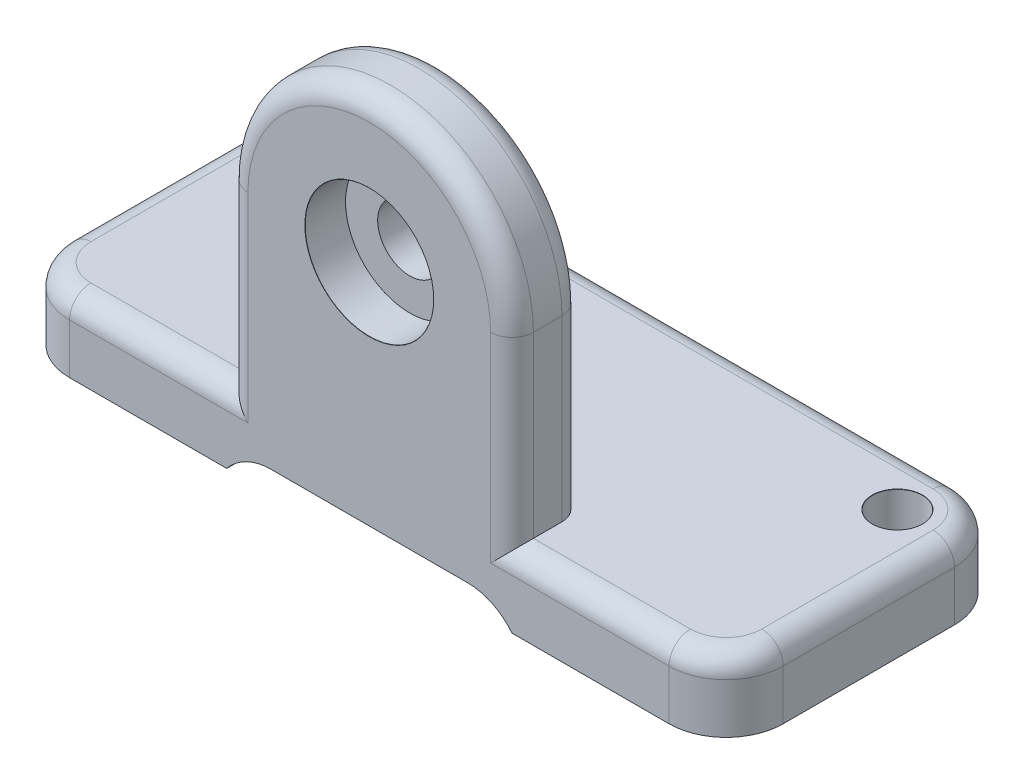
ISO-10303-21;
HEADER;
FILE_DESCRIPTION(('STEP AP214'),'2;1');
FILE_NAME('part.step','',(''),(''),'','','');
FILE_SCHEMA(('AUTOMOTIVE_DESIGN { 1 0 10303 214 1 1 1 1 }'));
ENDSEC;
DATA;
#1=APPLICATION_CONTEXT('core data for automotive mechanical design processes');
#2=APPLICATION_PROTOCOL_DEFINITION('international standard','automotive_design',2000,#1);
#3=PRODUCT_CONTEXT('',#1,'mechanical');
#4=PRODUCT('Part','Part','',(#3));
#5=PRODUCT_RELATED_PRODUCT_CATEGORY('part','',(#4));
#6=PRODUCT_DEFINITION_FORMATION('','',#4);
#7=PRODUCT_DEFINITION_CONTEXT('part definition',#1,'design');
#8=PRODUCT_DEFINITION('design','',#6,#7);
#9=PRODUCT_DEFINITION_SHAPE('','',#8);
#10=(LENGTH_UNIT() NAMED_UNIT(*) SI_UNIT(.MILLI.,.METRE.));
#11=(NAMED_UNIT(*) PLANE_ANGLE_UNIT() SI_UNIT($,.RADIAN.));
#12=(NAMED_UNIT(*) SI_UNIT($,.STERADIAN.) SOLID_ANGLE_UNIT());
#13=UNCERTAINTY_MEASURE_WITH_UNIT(LENGTH_MEASURE(1.E-05),#10,'distance_accuracy_value','');
#14=(GEOMETRIC_REPRESENTATION_CONTEXT(3) GLOBAL_UNCERTAINTY_ASSIGNED_CONTEXT((#13)) GLOBAL_UNIT_ASSIGNED_CONTEXT((#10,
#11,#12)) REPRESENTATION_CONTEXT('',''));
#15=CARTESIAN_POINT('',(0.,0.,0.));
#16=DIRECTION('',(0.,0.,1.));
#17=DIRECTION('',(1.,0.,0.));
#18=AXIS2_PLACEMENT_3D('',#15,#16,#17);
#19=CARTESIAN_POINT('',(0.,0.,0.));
#20=DIRECTION('',(0.,-1.,0.));
#21=DIRECTION('',(0.,0.,-1.));
#22=AXIS2_PLACEMENT_3D('',#19,#20,#21);
#23=PLANE('',#22);
#24=CARTESIAN_POINT('',(8.,0.,-32.));
#25=DIRECTION('',(0.,1.,0.));
#26=DIRECTION('',(0.,0.,1.));
#27=AXIS2_PLACEMENT_3D('',#24,#25,#26);
#28=CIRCLE('',#27,3.5);
#29=CARTESIAN_POINT('',(8.,0.,-28.5));
#30=VERTEX_POINT('',#29);
#31=EDGE_CURVE('E573',#30,#30,#28,.T.);
#32=ORIENTED_EDGE('',*,*,#31,.T.);
#33=EDGE_LOOP('',(#32));
#34=FACE_BOUND('',#33,.T.);
#35=DIRECTION('',(0.,0.,1.));
#36=VECTOR('',#35,1.);
#37=CARTESIAN_POINT('',(0.,0.,0.));
#38=LINE('',#37,#36);
#39=CARTESIAN_POINT('',(0.,0.,-32.));
#40=VERTEX_POINT('',#39);
#41=CARTESIAN_POINT('',(0.,0.,-8.));
#42=VERTEX_POINT('',#41);
#43=EDGE_CURVE('E264',#40,#42,#38,.T.);
#44=ORIENTED_EDGE('',*,*,#43,.F.);
#45=CARTESIAN_POINT('',(8.,0.,-32.));
#46=DIRECTION('',(0.,-1.,0.));
#47=DIRECTION('',(0.,0.,-1.));
#48=AXIS2_PLACEMENT_3D('',#45,#46,#47);
#49=CIRCLE('',#48,8.);
#50=CARTESIAN_POINT('',(8.,0.,-40.));
#51=VERTEX_POINT('',#50);
#52=EDGE_CURVE('E226',#40,#51,#49,.T.);
#53=ORIENTED_EDGE('',*,*,#52,.T.);
#54=DIRECTION('',(-1.,0.,0.));
#55=VECTOR('',#54,1.);
#56=CARTESIAN_POINT('',(0.,0.,-40.));
#57=LINE('',#56,#55);
#58=CARTESIAN_POINT('',(30.0374723293531,0.,-40.));
#59=VERTEX_POINT('',#58);
#60=EDGE_CURVE('E209',#59,#51,#57,.T.);
#61=ORIENTED_EDGE('',*,*,#60,.F.);
#62=DIRECTION('',(0.,0.,1.));
#63=VECTOR('',#62,1.);
#64=CARTESIAN_POINT('',(30.0374723293531,0.,-40.));
#65=LINE('',#64,#63);
#66=CARTESIAN_POINT('',(30.0374723293531,0.,0.));
#67=VERTEX_POINT('',#66);
#68=EDGE_CURVE('E224',#59,#67,#65,.T.);
#69=ORIENTED_EDGE('',*,*,#68,.T.);
#70=DIRECTION('',(1.,0.,0.));
#71=VECTOR('',#70,1.);
#72=CARTESIAN_POINT('',(0.,0.,0.));
#73=LINE('',#72,#71);
#74=CARTESIAN_POINT('',(8.,0.,0.));
#75=VERTEX_POINT('',#74);
#76=EDGE_CURVE('E269',#75,#67,#73,.T.);
#77=ORIENTED_EDGE('',*,*,#76,.F.);
#78=CARTESIAN_POINT('',(8.,0.,-8.));
#79=DIRECTION('',(0.,-1.,0.));
#80=DIRECTION('',(0.,0.,-1.));
#81=AXIS2_PLACEMENT_3D('',#78,#79,#80);
#82=CIRCLE('',#81,8.);
#83=EDGE_CURVE('E309',#75,#42,#82,.T.);
#84=ORIENTED_EDGE('',*,*,#83,.T.);
#85=EDGE_LOOP('',(#44,#53,#61,#69,#77,#84));
#86=FACE_BOUND('',#85,.T.);
#87=ADVANCED_FACE('F41',(#34,#86),#23,.T.);
#88=CARTESIAN_POINT('',(0.,10.,0.));
#89=DIRECTION('',(1.,0.,0.));
#90=DIRECTION('',(0.,0.,-1.));
#91=AXIS2_PLACEMENT_3D('',#88,#89,#90);
#92=PLANE('',#91);
#93=DIRECTION('',(0.,-1.,0.));
#94=VECTOR('',#93,1.);
#95=CARTESIAN_POINT('',(0.,10.,-8.));
#96=LINE('',#95,#94);
#97=CARTESIAN_POINT('',(0.,7.,-8.));
#98=VERTEX_POINT('',#97);
#99=EDGE_CURVE('E302',#42,#98,#96,.F.);
#100=ORIENTED_EDGE('',*,*,#99,.T.);
#101=DIRECTION('',(0.,0.,1.));
#102=VECTOR('',#101,1.);
#103=CARTESIAN_POINT('',(0.,7.,0.));
#104=LINE('',#103,#102);
#105=CARTESIAN_POINT('',(0.,7.,-32.));
#106=VERTEX_POINT('',#105);
#107=EDGE_CURVE('E381',#98,#106,#104,.F.);
#108=ORIENTED_EDGE('',*,*,#107,.T.);
#109=DIRECTION('',(0.,-1.,0.));
#110=VECTOR('',#109,1.);
#111=CARTESIAN_POINT('',(0.,10.,-32.));
#112=LINE('',#111,#110);
#113=EDGE_CURVE('E306',#106,#40,#112,.T.);
#114=ORIENTED_EDGE('',*,*,#113,.T.);
#115=ORIENTED_EDGE('',*,*,#43,.T.);
#116=EDGE_LOOP('',(#100,#108,#114,#115));
#117=FACE_BOUND('',#116,.T.);
#118=ADVANCED_FACE('F615',(#117),#92,.F.);
#119=CARTESIAN_POINT('',(0.,10.,0.));
#120=DIRECTION('',(0.,0.,-1.));
#121=DIRECTION('',(-1.,0.,0.));
#122=AXIS2_PLACEMENT_3D('',#119,#120,#121);
#123=PLANE('',#122);
#124=DIRECTION('',(0.,-1.,0.));
#125=VECTOR('',#124,1.);
#126=CARTESIAN_POINT('',(92.,10.,0.));
#127=LINE('',#126,#125);
#128=CARTESIAN_POINT('',(92.,0.,0.));
#129=VERTEX_POINT('',#128);
#130=CARTESIAN_POINT('',(92.,7.,0.));
#131=VERTEX_POINT('',#130);
#132=EDGE_CURVE('E292',#129,#131,#127,.F.);
#133=ORIENTED_EDGE('',*,*,#132,.T.);
#134=DIRECTION('',(1.,0.,0.));
#135=VECTOR('',#134,1.);
#136=CARTESIAN_POINT('',(0.,7.,0.));
#137=LINE('',#136,#135);
#138=CARTESIAN_POINT('',(67.,7.,0.));
#139=VERTEX_POINT('',#138);
#140=EDGE_CURVE('E375',#131,#139,#137,.F.);
#141=ORIENTED_EDGE('',*,*,#140,.T.);
#142=DIRECTION('',(0.,1.,0.));
#143=VECTOR('',#142,1.);
#144=CARTESIAN_POINT('',(67.,35.,0.));
#145=LINE('',#144,#143);
#146=CARTESIAN_POINT('',(67.,35.,0.));
#147=VERTEX_POINT('',#146);
#148=EDGE_CURVE('E368',#139,#147,#145,.T.);
#149=ORIENTED_EDGE('',*,*,#148,.T.);
#150=CARTESIAN_POINT('',(50.,35.,0.));
#151=DIRECTION('',(0.,0.,-1.));
#152=DIRECTION('',(-1.,0.,0.));
#153=AXIS2_PLACEMENT_3D('',#150,#151,#152);
#154=CIRCLE('',#153,17.);
#155=CARTESIAN_POINT('',(33.,35.,0.));
#156=VERTEX_POINT('',#155);
#157=EDGE_CURVE('E362',#147,#156,#154,.F.);
#158=ORIENTED_EDGE('',*,*,#157,.T.);
#159=DIRECTION('',(0.,-1.,0.));
#160=VECTOR('',#159,1.);
#161=CARTESIAN_POINT('',(33.,10.,0.));
#162=LINE('',#161,#160);
#163=CARTESIAN_POINT('',(33.,7.,0.));
#164=VERTEX_POINT('',#163);
#165=EDGE_CURVE('E365',#156,#164,#162,.T.);
#166=ORIENTED_EDGE('',*,*,#165,.T.);
#167=DIRECTION('',(1.,0.,0.));
#168=VECTOR('',#167,1.);
#169=CARTESIAN_POINT('',(0.,7.,0.));
#170=LINE('',#169,#168);
#171=CARTESIAN_POINT('',(8.,7.,0.));
#172=VERTEX_POINT('',#171);
#173=EDGE_CURVE('E371',#164,#172,#170,.F.);
#174=ORIENTED_EDGE('',*,*,#173,.T.);
#175=DIRECTION('',(0.,-1.,0.));
#176=VECTOR('',#175,1.);
#177=CARTESIAN_POINT('',(8.,10.,0.));
#178=LINE('',#177,#176);
#179=EDGE_CURVE('E289',#172,#75,#178,.T.);
#180=ORIENTED_EDGE('',*,*,#179,.T.);
#181=ORIENTED_EDGE('',*,*,#76,.T.);
#182=CARTESIAN_POINT('',(36.2824703277515,-5.,0.));
#183=DIRECTION('',(0.,0.,-1.));
#184=DIRECTION('',(-1.,0.,0.));
#185=AXIS2_PLACEMENT_3D('',#182,#183,#184);
#186=CIRCLE('',#185,8.);
#187=CARTESIAN_POINT('',(36.2824703277515,3.,0.));
#188=VERTEX_POINT('',#187);
#189=EDGE_CURVE('E218',#67,#188,#186,.T.);
#190=ORIENTED_EDGE('',*,*,#189,.T.);
#191=DIRECTION('',(-1.,0.,0.));
#192=VECTOR('',#191,1.);
#193=CARTESIAN_POINT('',(30.0374723293531,3.,0.));
#194=LINE('',#193,#192);
#195=CARTESIAN_POINT('',(63.7550020016016,3.,0.));
#196=VERTEX_POINT('',#195);
#197=EDGE_CURVE('E241',#196,#188,#194,.T.);
#198=ORIENTED_EDGE('',*,*,#197,.F.);
#199=CARTESIAN_POINT('',(63.7550020016016,-5.,0.));
#200=DIRECTION('',(0.,0.,-1.));
#201=DIRECTION('',(-1.,0.,0.));
#202=AXIS2_PLACEMENT_3D('',#199,#200,#201);
#203=CIRCLE('',#202,8.);
#204=CARTESIAN_POINT('',(70.,0.,0.));
#205=VERTEX_POINT('',#204);
#206=EDGE_CURVE('E321',#196,#205,#203,.T.);
#207=ORIENTED_EDGE('',*,*,#206,.T.);
#208=EDGE_CURVE('E268',#205,#129,#73,.T.);
#209=ORIENTED_EDGE('',*,*,#208,.T.);
#210=EDGE_LOOP('',(#133,#141,#149,#158,#166,#174,#180,#181,#190,#198,#207,#209));
#211=FACE_BOUND('',#210,.T.);
#212=CARTESIAN_POINT('',(50.,35.,0.));
#213=DIRECTION('',(0.,0.,1.));
#214=DIRECTION('',(1.,0.,0.));
#215=AXIS2_PLACEMENT_3D('',#212,#213,#214);
#216=CIRCLE('',#215,9.03);
#217=CARTESIAN_POINT('',(59.03,35.,0.));
#218=VERTEX_POINT('',#217);
#219=EDGE_CURVE('E472',#218,#218,#216,.T.);
#220=ORIENTED_EDGE('',*,*,#219,.F.);
#221=EDGE_LOOP('',(#220));
#222=FACE_BOUND('',#221,.T.);
#223=ADVANCED_FACE('F563',(#211,#222),#123,.F.);
#224=CARTESIAN_POINT('',(100.,10.,0.));
#225=DIRECTION('',(-1.,0.,0.));
#226=DIRECTION('',(0.,0.,1.));
#227=AXIS2_PLACEMENT_3D('',#224,#225,#226);
#228=PLANE('',#227);
#229=DIRECTION('',(0.,-1.,0.));
#230=VECTOR('',#229,1.);
#231=CARTESIAN_POINT('',(100.,10.,-32.));
#232=LINE('',#231,#230);
#233=CARTESIAN_POINT('',(100.,0.,-32.));
#234=VERTEX_POINT('',#233);
#235=CARTESIAN_POINT('',(100.,7.,-32.));
#236=VERTEX_POINT('',#235);
#237=EDGE_CURVE('E276',#234,#236,#232,.F.);
#238=ORIENTED_EDGE('',*,*,#237,.T.);
#239=DIRECTION('',(0.,0.,-1.));
#240=VECTOR('',#239,1.);
#241=CARTESIAN_POINT('',(100.,7.,0.));
#242=LINE('',#241,#240);
#243=CARTESIAN_POINT('',(100.,7.,-8.));
#244=VERTEX_POINT('',#243);
#245=EDGE_CURVE('E393',#236,#244,#242,.F.);
#246=ORIENTED_EDGE('',*,*,#245,.T.);
#247=DIRECTION('',(0.,-1.,0.));
#248=VECTOR('',#247,1.);
#249=CARTESIAN_POINT('',(100.,10.,-8.));
#250=LINE('',#249,#248);
#251=CARTESIAN_POINT('',(100.,0.,-8.));
#252=VERTEX_POINT('',#251);
#253=EDGE_CURVE('E280',#244,#252,#250,.T.);
#254=ORIENTED_EDGE('',*,*,#253,.T.);
#255=DIRECTION('',(0.,0.,-1.));
#256=VECTOR('',#255,1.);
#257=CARTESIAN_POINT('',(100.,0.,0.));
#258=LINE('',#257,#256);
#259=EDGE_CURVE('E229',#252,#234,#258,.T.);
#260=ORIENTED_EDGE('',*,*,#259,.T.);
#261=EDGE_LOOP('',(#238,#246,#254,#260));
#262=FACE_BOUND('',#261,.T.);
#263=ADVANCED_FACE('F614',(#262),#228,.F.);
#264=CARTESIAN_POINT('',(0.,10.,-40.));
#265=DIRECTION('',(0.,0.,1.));
#266=DIRECTION('',(1.,0.,0.));
#267=AXIS2_PLACEMENT_3D('',#264,#265,#266);
#268=PLANE('',#267);
#269=DIRECTION('',(0.,-1.,0.));
#270=VECTOR('',#269,1.);
#271=CARTESIAN_POINT('',(8.,10.,-40.));
#272=LINE('',#271,#270);
#273=CARTESIAN_POINT('',(8.,7.,-40.));
#274=VERTEX_POINT('',#273);
#275=EDGE_CURVE('E296',#51,#274,#272,.F.);
#276=ORIENTED_EDGE('',*,*,#275,.T.);
#277=DIRECTION('',(-1.,0.,0.));
#278=VECTOR('',#277,1.);
#279=CARTESIAN_POINT('',(0.,7.,-40.));
#280=LINE('',#279,#278);
#281=CARTESIAN_POINT('',(92.,7.,-40.));
#282=VERTEX_POINT('',#281);
#283=EDGE_CURVE('E387',#274,#282,#280,.F.);
#284=ORIENTED_EDGE('',*,*,#283,.T.);
#285=DIRECTION('',(0.,-1.,0.));
#286=VECTOR('',#285,1.);
#287=CARTESIAN_POINT('',(92.,10.,-40.));
#288=LINE('',#287,#286);
#289=CARTESIAN_POINT('',(92.,0.,-40.));
#290=VERTEX_POINT('',#289);
#291=EDGE_CURVE('E299',#282,#290,#288,.T.);
#292=ORIENTED_EDGE('',*,*,#291,.T.);
#293=CARTESIAN_POINT('',(70.,0.,-40.));
#294=VERTEX_POINT('',#293);
#295=EDGE_CURVE('E228',#290,#294,#57,.T.);
#296=ORIENTED_EDGE('',*,*,#295,.T.);
#297=CARTESIAN_POINT('',(63.7550020016016,-5.,-40.));
#298=DIRECTION('',(0.,0.,1.));
#299=DIRECTION('',(1.,0.,0.));
#300=AXIS2_PLACEMENT_3D('',#297,#298,#299);
#301=CIRCLE('',#300,8.);
#302=CARTESIAN_POINT('',(63.7550020016016,3.,-40.));
#303=VERTEX_POINT('',#302);
#304=EDGE_CURVE('E324',#294,#303,#301,.T.);
#305=ORIENTED_EDGE('',*,*,#304,.T.);
#306=DIRECTION('',(-1.,0.,0.));
#307=VECTOR('',#306,1.);
#308=CARTESIAN_POINT('',(30.0374723293531,3.,-40.));
#309=LINE('',#308,#307);
#310=CARTESIAN_POINT('',(36.2824703277515,3.,-40.));
#311=VERTEX_POINT('',#310);
#312=EDGE_CURVE('E212',#303,#311,#309,.T.);
#313=ORIENTED_EDGE('',*,*,#312,.T.);
#314=CARTESIAN_POINT('',(36.2824703277515,-5.,-40.));
#315=DIRECTION('',(0.,0.,1.));
#316=DIRECTION('',(1.,0.,0.));
#317=AXIS2_PLACEMENT_3D('',#314,#315,#316);
#318=CIRCLE('',#317,8.);
#319=EDGE_CURVE('E205',#311,#59,#318,.T.);
#320=ORIENTED_EDGE('',*,*,#319,.T.);
#321=ORIENTED_EDGE('',*,*,#60,.T.);
#322=EDGE_LOOP('',(#276,#284,#292,#296,#305,#313,#320,#321));
#323=FACE_BOUND('',#322,.T.);
#324=ADVANCED_FACE('F208',(#323),#268,.F.);
#325=CARTESIAN_POINT('',(0.,10.,0.));
#326=DIRECTION('',(0.,-1.,0.));
#327=DIRECTION('',(0.,0.,-1.));
#328=AXIS2_PLACEMENT_3D('',#325,#326,#327);
#329=PLANE('',#328);
#330=CARTESIAN_POINT('',(92.,10.,-32.));
#331=DIRECTION('',(0.,1.,0.));
#332=DIRECTION('',(0.,0.,1.));
#333=AXIS2_PLACEMENT_3D('',#330,#331,#332);
#334=CIRCLE('',#333,3.525);
#335=CARTESIAN_POINT('',(92.,10.,-28.475));
#336=VERTEX_POINT('',#335);
#337=EDGE_CURVE('E333',#336,#336,#334,.T.);
#338=ORIENTED_EDGE('',*,*,#337,.F.);
#339=EDGE_LOOP('',(#338));
#340=FACE_BOUND('',#339,.T.);
#341=CARTESIAN_POINT('',(8.,10.,-32.));
#342=DIRECTION('',(0.,1.,0.));
#343=DIRECTION('',(0.,0.,1.));
#344=AXIS2_PLACEMENT_3D('',#341,#342,#343);
#345=CIRCLE('',#344,3.525);
#346=CARTESIAN_POINT('',(8.,10.,-28.475));
#347=VERTEX_POINT('',#346);
#348=EDGE_CURVE('E582',#347,#347,#345,.T.);
#349=ORIENTED_EDGE('',*,*,#348,.F.);
#350=EDGE_LOOP('',(#349));
#351=FACE_BOUND('',#350,.T.);
#352=CARTESIAN_POINT('',(8.,10.,-8.));
#353=DIRECTION('',(0.,-1.,0.));
#354=DIRECTION('',(0.,0.,-1.));
#355=AXIS2_PLACEMENT_3D('',#352,#353,#354);
#356=CIRCLE('',#355,5.);
#357=CARTESIAN_POINT('',(3.,10.,-8.));
#358=VERTEX_POINT('',#357);
#359=CARTESIAN_POINT('',(8.,10.,-3.));
#360=VERTEX_POINT('',#359);
#361=EDGE_CURVE('E355',#358,#360,#356,.F.);
#362=ORIENTED_EDGE('',*,*,#361,.T.);
#363=DIRECTION('',(1.,0.,0.));
#364=VECTOR('',#363,1.);
#365=CARTESIAN_POINT('',(0.,10.,-3.));
#366=LINE('',#365,#364);
#367=CARTESIAN_POINT('',(30.,10.,-3.));
#368=VERTEX_POINT('',#367);
#369=EDGE_CURVE('E358',#360,#368,#366,.T.);
#370=ORIENTED_EDGE('',*,*,#369,.T.);
#371=DIRECTION('',(0.,0.,-1.));
#372=VECTOR('',#371,1.);
#373=CARTESIAN_POINT('',(30.,10.,0.));
#374=LINE('',#373,#372);
#375=CARTESIAN_POINT('',(30.,10.,-7.));
#376=VERTEX_POINT('',#375);
#377=EDGE_CURVE('E260',#368,#376,#374,.T.);
#378=ORIENTED_EDGE('',*,*,#377,.T.);
#379=CARTESIAN_POINT('',(33.,10.,-7.));
#380=DIRECTION('',(0.,-1.,0.));
#381=DIRECTION('',(0.,0.,-1.));
#382=AXIS2_PLACEMENT_3D('',#379,#380,#381);
#383=CIRCLE('',#382,3.);
#384=CARTESIAN_POINT('',(33.,10.,-10.));
#385=VERTEX_POINT('',#384);
#386=EDGE_CURVE('E11',#376,#385,#383,.T.);
#387=ORIENTED_EDGE('',*,*,#386,.T.);
#388=DIRECTION('',(1.,0.,0.));
#389=VECTOR('',#388,1.);
#390=CARTESIAN_POINT('',(0.,10.,-10.));
#391=LINE('',#390,#389);
#392=CARTESIAN_POINT('',(67.,10.,-10.));
#393=VERTEX_POINT('',#392);
#394=EDGE_CURVE('E249',#385,#393,#391,.T.);
#395=ORIENTED_EDGE('',*,*,#394,.T.);
#396=CARTESIAN_POINT('',(67.,10.,-7.));
#397=DIRECTION('',(0.,-1.,0.));
#398=DIRECTION('',(0.,0.,-1.));
#399=AXIS2_PLACEMENT_3D('',#396,#397,#398);
#400=CIRCLE('',#399,3.);
#401=CARTESIAN_POINT('',(70.,10.,-7.));
#402=VERTEX_POINT('',#401);
#403=EDGE_CURVE('E51',#393,#402,#400,.T.);
#404=ORIENTED_EDGE('',*,*,#403,.T.);
#405=DIRECTION('',(0.,0.,1.));
#406=VECTOR('',#405,1.);
#407=CARTESIAN_POINT('',(70.,10.,0.));
#408=LINE('',#407,#406);
#409=CARTESIAN_POINT('',(70.,10.,-3.));
#410=VERTEX_POINT('',#409);
#411=EDGE_CURVE('E256',#402,#410,#408,.T.);
#412=ORIENTED_EDGE('',*,*,#411,.T.);
#413=DIRECTION('',(1.,0.,0.));
#414=VECTOR('',#413,1.);
#415=CARTESIAN_POINT('',(0.,10.,-3.));
#416=LINE('',#415,#414);
#417=CARTESIAN_POINT('',(92.,10.,-3.));
#418=VERTEX_POINT('',#417);
#419=EDGE_CURVE('E217',#410,#418,#416,.T.);
#420=ORIENTED_EDGE('',*,*,#419,.T.);
#421=CARTESIAN_POINT('',(92.,10.,-8.));
#422=DIRECTION('',(0.,-1.,0.));
#423=DIRECTION('',(0.,0.,-1.));
#424=AXIS2_PLACEMENT_3D('',#421,#422,#423);
#425=CIRCLE('',#424,5.);
#426=CARTESIAN_POINT('',(97.,10.,-8.));
#427=VERTEX_POINT('',#426);
#428=EDGE_CURVE('E337',#418,#427,#425,.F.);
#429=ORIENTED_EDGE('',*,*,#428,.T.);
#430=DIRECTION('',(0.,0.,-1.));
#431=VECTOR('',#430,1.);
#432=CARTESIAN_POINT('',(97.,10.,0.));
#433=LINE('',#432,#431);
#434=CARTESIAN_POINT('',(97.,10.,-32.));
#435=VERTEX_POINT('',#434);
#436=EDGE_CURVE('E340',#427,#435,#433,.T.);
#437=ORIENTED_EDGE('',*,*,#436,.T.);
#438=CARTESIAN_POINT('',(92.,10.,-32.));
#439=DIRECTION('',(0.,-1.,0.));
#440=DIRECTION('',(0.,0.,-1.));
#441=AXIS2_PLACEMENT_3D('',#438,#439,#440);
#442=CIRCLE('',#441,5.);
#443=CARTESIAN_POINT('',(92.,10.,-37.));
#444=VERTEX_POINT('',#443);
#445=EDGE_CURVE('E343',#435,#444,#442,.F.);
#446=ORIENTED_EDGE('',*,*,#445,.T.);
#447=DIRECTION('',(-1.,0.,0.));
#448=VECTOR('',#447,1.);
#449=CARTESIAN_POINT('',(0.,10.,-37.));
#450=LINE('',#449,#448);
#451=CARTESIAN_POINT('',(8.,10.,-37.));
#452=VERTEX_POINT('',#451);
#453=EDGE_CURVE('E346',#444,#452,#450,.T.);
#454=ORIENTED_EDGE('',*,*,#453,.T.);
#455=CARTESIAN_POINT('',(8.,10.,-32.));
#456=DIRECTION('',(0.,-1.,0.));
#457=DIRECTION('',(0.,0.,-1.));
#458=AXIS2_PLACEMENT_3D('',#455,#456,#457);
#459=CIRCLE('',#458,5.);
#460=CARTESIAN_POINT('',(3.,10.,-32.));
#461=VERTEX_POINT('',#460);
#462=EDGE_CURVE('E349',#452,#461,#459,.F.);
#463=ORIENTED_EDGE('',*,*,#462,.T.);
#464=DIRECTION('',(0.,0.,1.));
#465=VECTOR('',#464,1.);
#466=CARTESIAN_POINT('',(3.,10.,0.));
#467=LINE('',#466,#465);
#468=EDGE_CURVE('E352',#461,#358,#467,.T.);
#469=ORIENTED_EDGE('',*,*,#468,.T.);
#470=EDGE_LOOP('',(#362,#370,#378,#387,#395,#404,#412,#420,#429,#437,#446,#454,#463,#469));
#471=FACE_BOUND('',#470,.T.);
#472=ADVANCED_FACE('F491',(#340,#351,#471),#329,.F.);
#473=CARTESIAN_POINT('',(92.,0.,-32.));
#474=DIRECTION('',(0.,1.,0.));
#475=DIRECTION('',(0.,0.,1.));
#476=AXIS2_PLACEMENT_3D('',#473,#474,#475);
#477=CIRCLE('',#476,3.5);
#478=CARTESIAN_POINT('',(92.,0.,-28.5));
#479=VERTEX_POINT('',#478);
#480=EDGE_CURVE('E586',#479,#479,#477,.T.);
#481=ORIENTED_EDGE('',*,*,#480,.T.);
#482=EDGE_LOOP('',(#481));
#483=FACE_BOUND('',#482,.T.);
#484=ORIENTED_EDGE('',*,*,#259,.F.);
#485=CARTESIAN_POINT('',(92.,0.,-8.));
#486=DIRECTION('',(0.,-1.,0.));
#487=DIRECTION('',(0.,0.,-1.));
#488=AXIS2_PLACEMENT_3D('',#485,#486,#487);
#489=CIRCLE('',#488,8.);
#490=EDGE_CURVE('E286',#252,#129,#489,.T.);
#491=ORIENTED_EDGE('',*,*,#490,.T.);
#492=ORIENTED_EDGE('',*,*,#208,.F.);
#493=DIRECTION('',(0.,0.,1.));
#494=VECTOR('',#493,1.);
#495=CARTESIAN_POINT('',(70.,0.,-40.));
#496=LINE('',#495,#494);
#497=EDGE_CURVE('E234',#294,#205,#496,.T.);
#498=ORIENTED_EDGE('',*,*,#497,.F.);
#499=ORIENTED_EDGE('',*,*,#295,.F.);
#500=CARTESIAN_POINT('',(92.,0.,-32.));
#501=DIRECTION('',(0.,-1.,0.));
#502=DIRECTION('',(0.,0.,-1.));
#503=AXIS2_PLACEMENT_3D('',#500,#501,#502);
#504=CIRCLE('',#503,8.);
#505=EDGE_CURVE('E283',#290,#234,#504,.T.);
#506=ORIENTED_EDGE('',*,*,#505,.T.);
#507=EDGE_LOOP('',(#484,#491,#492,#498,#499,#506));
#508=FACE_BOUND('',#507,.T.);
#509=ADVANCED_FACE('F628',(#483,#508),#23,.T.);
#510=CARTESIAN_POINT('',(30.,0.,-10.));
#511=DIRECTION('',(-1.,0.,0.));
#512=DIRECTION('',(0.,0.,1.));
#513=AXIS2_PLACEMENT_3D('',#510,#511,#512);
#514=PLANE('',#513);
#515=ORIENTED_EDGE('',*,*,#377,.F.);
#516=DIRECTION('',(0.,-1.,0.));
#517=VECTOR('',#516,1.);
#518=CARTESIAN_POINT('',(30.,35.,-3.));
#519=LINE('',#518,#517);
#520=CARTESIAN_POINT('',(30.,35.,-3.));
#521=VERTEX_POINT('',#520);
#522=EDGE_CURVE('E409',#368,#521,#519,.F.);
#523=ORIENTED_EDGE('',*,*,#522,.T.);
#524=DIRECTION('',(0.,0.,1.));
#525=VECTOR('',#524,1.);
#526=CARTESIAN_POINT('',(30.,35.,-10.));
#527=LINE('',#526,#525);
#528=CARTESIAN_POINT('',(30.,35.,-7.));
#529=VERTEX_POINT('',#528);
#530=EDGE_CURVE('E245',#529,#521,#527,.T.);
#531=ORIENTED_EDGE('',*,*,#530,.F.);
#532=DIRECTION('',(0.,-1.,0.));
#533=VECTOR('',#532,1.);
#534=CARTESIAN_POINT('',(30.,0.,-7.));
#535=LINE('',#534,#533);
#536=EDGE_CURVE('E406',#529,#376,#535,.T.);
#537=ORIENTED_EDGE('',*,*,#536,.T.);
#538=EDGE_LOOP('',(#515,#523,#531,#537));
#539=FACE_BOUND('',#538,.T.);
#540=ADVANCED_FACE('F489',(#539),#514,.T.);
#541=CARTESIAN_POINT('',(70.,0.,-10.));
#542=DIRECTION('',(1.,0.,0.));
#543=DIRECTION('',(0.,0.,-1.));
#544=AXIS2_PLACEMENT_3D('',#541,#542,#543);
#545=PLANE('',#544);
#546=DIRECTION('',(0.,0.,1.));
#547=VECTOR('',#546,1.);
#548=CARTESIAN_POINT('',(70.,35.,-10.));
#549=LINE('',#548,#547);
#550=CARTESIAN_POINT('',(70.,35.,-7.));
#551=VERTEX_POINT('',#550);
#552=CARTESIAN_POINT('',(70.,35.,-3.));
#553=VERTEX_POINT('',#552);
#554=EDGE_CURVE('E239',#551,#553,#549,.T.);
#555=ORIENTED_EDGE('',*,*,#554,.T.);
#556=DIRECTION('',(0.,1.,0.));
#557=VECTOR('',#556,1.);
#558=CARTESIAN_POINT('',(70.,10.,-3.));
#559=LINE('',#558,#557);
#560=EDGE_CURVE('E403',#553,#410,#559,.F.);
#561=ORIENTED_EDGE('',*,*,#560,.T.);
#562=ORIENTED_EDGE('',*,*,#411,.F.);
#563=DIRECTION('',(0.,1.,0.));
#564=VECTOR('',#563,1.);
#565=CARTESIAN_POINT('',(70.,0.,-7.));
#566=LINE('',#565,#564);
#567=EDGE_CURVE('E399',#402,#551,#566,.T.);
#568=ORIENTED_EDGE('',*,*,#567,.T.);
#569=EDGE_LOOP('',(#555,#561,#562,#568));
#570=FACE_BOUND('',#569,.T.);
#571=ADVANCED_FACE('F520',(#570),#545,.T.);
#572=CARTESIAN_POINT('',(50.,35.,-10.));
#573=DIRECTION('',(0.,0.,-1.));
#574=DIRECTION('',(-1.,0.,0.));
#575=AXIS2_PLACEMENT_3D('',#572,#573,#574);
#576=PLANE('',#575);
#577=CARTESIAN_POINT('',(50.,35.,-10.));
#578=DIRECTION('',(0.,0.,-1.));
#579=DIRECTION('',(-1.,0.,0.));
#580=AXIS2_PLACEMENT_3D('',#577,#578,#579);
#581=CIRCLE('',#580,4.49999999999999);
#582=CARTESIAN_POINT('',(45.5,35.,-10.));
#583=VERTEX_POINT('',#582);
#584=EDGE_CURVE('E329',#583,#583,#581,.T.);
#585=ORIENTED_EDGE('',*,*,#584,.F.);
#586=EDGE_LOOP('',(#585));
#587=FACE_BOUND('',#586,.T.);
#588=CARTESIAN_POINT('',(50.,35.,-10.));
#589=DIRECTION('',(0.,0.,-1.));
#590=DIRECTION('',(-1.,0.,0.));
#591=AXIS2_PLACEMENT_3D('',#588,#589,#590);
#592=CIRCLE('',#591,17.);
#593=CARTESIAN_POINT('',(33.,35.,-10.));
#594=VERTEX_POINT('',#593);
#595=CARTESIAN_POINT('',(67.,35.,-10.));
#596=VERTEX_POINT('',#595);
#597=EDGE_CURVE('E59',#594,#596,#592,.T.);
#598=ORIENTED_EDGE('',*,*,#597,.T.);
#599=DIRECTION('',(0.,1.,0.));
#600=VECTOR('',#599,1.);
#601=CARTESIAN_POINT('',(67.,35.,-10.));
#602=LINE('',#601,#600);
#603=EDGE_CURVE('E416',#596,#393,#602,.F.);
#604=ORIENTED_EDGE('',*,*,#603,.T.);
#605=ORIENTED_EDGE('',*,*,#394,.F.);
#606=DIRECTION('',(0.,-1.,0.));
#607=VECTOR('',#606,1.);
#608=CARTESIAN_POINT('',(33.,35.,-10.));
#609=LINE('',#608,#607);
#610=EDGE_CURVE('E64',#385,#594,#609,.F.);
#611=ORIENTED_EDGE('',*,*,#610,.T.);
#612=EDGE_LOOP('',(#598,#604,#605,#611));
#613=FACE_BOUND('',#612,.T.);
#614=ADVANCED_FACE('F861',(#587,#613),#576,.T.);
#615=CARTESIAN_POINT('',(50.,35.,-10.));
#616=DIRECTION('',(0.,0.,1.));
#617=DIRECTION('',(1.,0.,0.));
#618=AXIS2_PLACEMENT_3D('',#615,#616,#617);
#619=CYLINDRICAL_SURFACE('',#618,20.);
#620=ORIENTED_EDGE('',*,*,#530,.T.);
#621=CARTESIAN_POINT('',(50.,35.,-3.));
#622=DIRECTION('',(0.,0.,-1.));
#623=DIRECTION('',(-1.,0.,0.));
#624=AXIS2_PLACEMENT_3D('',#621,#622,#623);
#625=CIRCLE('',#624,20.);
#626=EDGE_CURVE('E422',#521,#553,#625,.T.);
#627=ORIENTED_EDGE('',*,*,#626,.T.);
#628=ORIENTED_EDGE('',*,*,#554,.F.);
#629=CARTESIAN_POINT('',(50.,35.,-7.));
#630=DIRECTION('',(0.,0.,-1.));
#631=DIRECTION('',(-1.,0.,0.));
#632=AXIS2_PLACEMENT_3D('',#629,#630,#631);
#633=CIRCLE('',#632,20.);
#634=EDGE_CURVE('E419',#551,#529,#633,.F.);
#635=ORIENTED_EDGE('',*,*,#634,.T.);
#636=EDGE_LOOP('',(#620,#627,#628,#635));
#637=FACE_BOUND('',#636,.T.);
#638=ADVANCED_FACE('F507',(#637),#619,.T.);
#639=CARTESIAN_POINT('',(30.0374723293531,3.,-40.));
#640=DIRECTION('',(0.,1.,0.));
#641=DIRECTION('',(0.,0.,1.));
#642=AXIS2_PLACEMENT_3D('',#639,#640,#641);
#643=PLANE('',#642);
#644=ORIENTED_EDGE('',*,*,#312,.F.);
#645=DIRECTION('',(0.,0.,-1.));
#646=VECTOR('',#645,1.);
#647=CARTESIAN_POINT('',(63.7550020016016,3.,-40.));
#648=LINE('',#647,#646);
#649=EDGE_CURVE('E317',#303,#196,#648,.F.);
#650=ORIENTED_EDGE('',*,*,#649,.T.);
#651=ORIENTED_EDGE('',*,*,#197,.T.);
#652=DIRECTION('',(0.,0.,1.));
#653=VECTOR('',#652,1.);
#654=CARTESIAN_POINT('',(36.2824703277515,3.,-40.));
#655=LINE('',#654,#653);
#656=EDGE_CURVE('E314',#188,#311,#655,.F.);
#657=ORIENTED_EDGE('',*,*,#656,.T.);
#658=EDGE_LOOP('',(#644,#650,#651,#657));
#659=FACE_BOUND('',#658,.T.);
#660=ADVANCED_FACE('F570',(#659),#643,.F.);
#661=CARTESIAN_POINT('',(92.,10.,-8.));
#662=DIRECTION('',(0.,-1.,0.));
#663=DIRECTION('',(0.,0.,-1.));
#664=AXIS2_PLACEMENT_3D('',#661,#662,#663);
#665=CYLINDRICAL_SURFACE('',#664,8.);
#666=ORIENTED_EDGE('',*,*,#253,.F.);
#667=CARTESIAN_POINT('',(92.,7.,-8.));
#668=DIRECTION('',(0.,-1.,0.));
#669=DIRECTION('',(0.,0.,-1.));
#670=AXIS2_PLACEMENT_3D('',#667,#668,#669);
#671=CIRCLE('',#670,8.);
#672=EDGE_CURVE('E396',#244,#131,#671,.T.);
#673=ORIENTED_EDGE('',*,*,#672,.T.);
#674=ORIENTED_EDGE('',*,*,#132,.F.);
#675=ORIENTED_EDGE('',*,*,#490,.F.);
#676=EDGE_LOOP('',(#666,#673,#674,#675));
#677=FACE_BOUND('',#676,.T.);
#678=ADVANCED_FACE('F666',(#677),#665,.T.);
#679=CARTESIAN_POINT('',(92.,10.,-32.));
#680=DIRECTION('',(0.,-1.,0.));
#681=DIRECTION('',(0.,0.,-1.));
#682=AXIS2_PLACEMENT_3D('',#679,#680,#681);
#683=CYLINDRICAL_SURFACE('',#682,8.);
#684=ORIENTED_EDGE('',*,*,#291,.F.);
#685=CARTESIAN_POINT('',(92.,7.,-32.));
#686=DIRECTION('',(0.,-1.,0.));
#687=DIRECTION('',(0.,0.,-1.));
#688=AXIS2_PLACEMENT_3D('',#685,#686,#687);
#689=CIRCLE('',#688,8.);
#690=EDGE_CURVE('E390',#282,#236,#689,.T.);
#691=ORIENTED_EDGE('',*,*,#690,.T.);
#692=ORIENTED_EDGE('',*,*,#237,.F.);
#693=ORIENTED_EDGE('',*,*,#505,.F.);
#694=EDGE_LOOP('',(#684,#691,#692,#693));
#695=FACE_BOUND('',#694,.T.);
#696=ADVANCED_FACE('F653',(#695),#683,.T.);
#697=CARTESIAN_POINT('',(8.,10.,-32.));
#698=DIRECTION('',(0.,-1.,0.));
#699=DIRECTION('',(0.,0.,-1.));
#700=AXIS2_PLACEMENT_3D('',#697,#698,#699);
#701=CYLINDRICAL_SURFACE('',#700,8.);
#702=ORIENTED_EDGE('',*,*,#113,.F.);
#703=CARTESIAN_POINT('',(8.,7.,-32.));
#704=DIRECTION('',(0.,-1.,0.));
#705=DIRECTION('',(0.,0.,-1.));
#706=AXIS2_PLACEMENT_3D('',#703,#704,#705);
#707=CIRCLE('',#706,8.);
#708=EDGE_CURVE('E384',#106,#274,#707,.T.);
#709=ORIENTED_EDGE('',*,*,#708,.T.);
#710=ORIENTED_EDGE('',*,*,#275,.F.);
#711=ORIENTED_EDGE('',*,*,#52,.F.);
#712=EDGE_LOOP('',(#702,#709,#710,#711));
#713=FACE_BOUND('',#712,.T.);
#714=ADVANCED_FACE('F657',(#713),#701,.T.);
#715=CARTESIAN_POINT('',(8.,10.,-8.));
#716=DIRECTION('',(0.,-1.,0.));
#717=DIRECTION('',(0.,0.,-1.));
#718=AXIS2_PLACEMENT_3D('',#715,#716,#717);
#719=CYLINDRICAL_SURFACE('',#718,8.);
#720=ORIENTED_EDGE('',*,*,#179,.F.);
#721=CARTESIAN_POINT('',(8.,7.,-8.));
#722=DIRECTION('',(0.,-1.,0.));
#723=DIRECTION('',(0.,0.,-1.));
#724=AXIS2_PLACEMENT_3D('',#721,#722,#723);
#725=CIRCLE('',#724,8.);
#726=EDGE_CURVE('E378',#172,#98,#725,.T.);
#727=ORIENTED_EDGE('',*,*,#726,.T.);
#728=ORIENTED_EDGE('',*,*,#99,.F.);
#729=ORIENTED_EDGE('',*,*,#83,.F.);
#730=EDGE_LOOP('',(#720,#727,#728,#729));
#731=FACE_BOUND('',#730,.T.);
#732=ADVANCED_FACE('F566',(#731),#719,.T.);
#733=CARTESIAN_POINT('',(63.7550020016016,-5.,-40.));
#734=DIRECTION('',(0.,0.,-1.));
#735=DIRECTION('',(-1.,0.,0.));
#736=AXIS2_PLACEMENT_3D('',#733,#734,#735);
#737=CYLINDRICAL_SURFACE('',#736,8.);
#738=ORIENTED_EDGE('',*,*,#304,.F.);
#739=ORIENTED_EDGE('',*,*,#497,.T.);
#740=ORIENTED_EDGE('',*,*,#206,.F.);
#741=ORIENTED_EDGE('',*,*,#649,.F.);
#742=EDGE_LOOP('',(#738,#739,#740,#741));
#743=FACE_BOUND('',#742,.T.);
#744=ADVANCED_FACE('F664',(#743),#737,.F.);
#745=CARTESIAN_POINT('',(36.2824703277515,-5.,-40.));
#746=DIRECTION('',(0.,0.,1.));
#747=DIRECTION('',(1.,0.,0.));
#748=AXIS2_PLACEMENT_3D('',#745,#746,#747);
#749=CYLINDRICAL_SURFACE('',#748,8.);
#750=ORIENTED_EDGE('',*,*,#319,.F.);
#751=ORIENTED_EDGE('',*,*,#656,.F.);
#752=ORIENTED_EDGE('',*,*,#189,.F.);
#753=ORIENTED_EDGE('',*,*,#68,.F.);
#754=EDGE_LOOP('',(#750,#751,#752,#753));
#755=FACE_BOUND('',#754,.T.);
#756=ADVANCED_FACE('F231',(#755),#749,.F.);
#757=CARTESIAN_POINT('',(8.,10.,-32.));
#758=DIRECTION('',(0.,1.,0.));
#759=DIRECTION('',(0.,0.,1.));
#760=AXIS2_PLACEMENT_3D('',#757,#758,#759);
#761=CYLINDRICAL_SURFACE('',#760,3.5);
#762=ORIENTED_EDGE('',*,*,#31,.F.);
#763=EDGE_LOOP('',(#762));
#764=FACE_BOUND('',#763,.T.);
#765=CARTESIAN_POINT('',(8.,9.975,-32.));
#766=DIRECTION('',(0.,1.,0.));
#767=DIRECTION('',(0.,0.,1.));
#768=AXIS2_PLACEMENT_3D('',#765,#766,#767);
#769=CIRCLE('',#768,3.5);
#770=CARTESIAN_POINT('',(8.,9.975,-28.5));
#771=VERTEX_POINT('',#770);
#772=EDGE_CURVE('E576',#771,#771,#769,.T.);
#773=ORIENTED_EDGE('',*,*,#772,.T.);
#774=EDGE_LOOP('',(#773));
#775=FACE_BOUND('',#774,.T.);
#776=ADVANCED_FACE('F675',(#764,#775),#761,.F.);
#777=CARTESIAN_POINT('',(8.,10.,-32.));
#778=DIRECTION('',(0.,1.,0.));
#779=DIRECTION('',(0.,0.,1.));
#780=AXIS2_PLACEMENT_3D('',#777,#778,#779);
#781=CONICAL_SURFACE('',#780,3.525,0.785398163397448);
#782=ORIENTED_EDGE('',*,*,#772,.F.);
#783=EDGE_LOOP('',(#782));
#784=FACE_BOUND('',#783,.T.);
#785=ORIENTED_EDGE('',*,*,#348,.T.);
#786=EDGE_LOOP('',(#785));
#787=FACE_BOUND('',#786,.T.);
#788=ADVANCED_FACE('F804',(#784,#787),#781,.F.);
#789=CARTESIAN_POINT('',(92.,10.,-32.));
#790=DIRECTION('',(0.,1.,0.));
#791=DIRECTION('',(0.,0.,1.));
#792=AXIS2_PLACEMENT_3D('',#789,#790,#791);
#793=CYLINDRICAL_SURFACE('',#792,3.5);
#794=ORIENTED_EDGE('',*,*,#480,.F.);
#795=EDGE_LOOP('',(#794));
#796=FACE_BOUND('',#795,.T.);
#797=CARTESIAN_POINT('',(92.,9.97499999999997,-32.));
#798=DIRECTION('',(0.,1.,0.));
#799=DIRECTION('',(0.,0.,1.));
#800=AXIS2_PLACEMENT_3D('',#797,#798,#799);
#801=CIRCLE('',#800,3.49999999999999);
#802=CARTESIAN_POINT('',(92.,9.97499999999997,-28.5));
#803=VERTEX_POINT('',#802);
#804=EDGE_CURVE('E590',#803,#803,#801,.T.);
#805=ORIENTED_EDGE('',*,*,#804,.T.);
#806=EDGE_LOOP('',(#805));
#807=FACE_BOUND('',#806,.T.);
#808=ADVANCED_FACE('F796',(#796,#807),#793,.F.);
#809=CARTESIAN_POINT('',(92.,10.,-32.));
#810=DIRECTION('',(0.,1.,0.));
#811=DIRECTION('',(0.,0.,1.));
#812=AXIS2_PLACEMENT_3D('',#809,#810,#811);
#813=CONICAL_SURFACE('',#812,3.525,0.785398163397136);
#814=ORIENTED_EDGE('',*,*,#804,.F.);
#815=EDGE_LOOP('',(#814));
#816=FACE_BOUND('',#815,.T.);
#817=ORIENTED_EDGE('',*,*,#337,.T.);
#818=EDGE_LOOP('',(#817));
#819=FACE_BOUND('',#818,.T.);
#820=ADVANCED_FACE('F788',(#816,#819),#813,.F.);
#821=CARTESIAN_POINT('',(50.,35.,0.));
#822=DIRECTION('',(0.,0.,1.));
#823=DIRECTION('',(1.,0.,0.));
#824=AXIS2_PLACEMENT_3D('',#821,#822,#823);
#825=CYLINDRICAL_SURFACE('',#824,4.49999999999999);
#826=ORIENTED_EDGE('',*,*,#584,.T.);
#827=EDGE_LOOP('',(#826));
#828=FACE_BOUND('',#827,.T.);
#829=CARTESIAN_POINT('',(50.,35.,-5.68));
#830=DIRECTION('',(0.,0.,1.));
#831=DIRECTION('',(1.,0.,0.));
#832=AXIS2_PLACEMENT_3D('',#829,#830,#831);
#833=CIRCLE('',#832,4.5);
#834=CARTESIAN_POINT('',(54.5,35.,-5.68));
#835=VERTEX_POINT('',#834);
#836=EDGE_CURVE('E334',#835,#835,#833,.T.);
#837=ORIENTED_EDGE('',*,*,#836,.T.);
#838=EDGE_LOOP('',(#837));
#839=FACE_BOUND('',#838,.T.);
#840=ADVANCED_FACE('F780',(#828,#839),#825,.F.);
#841=CARTESIAN_POINT('',(59.005,35.,-5.68));
#842=DIRECTION('',(0.,0.,-1.));
#843=DIRECTION('',(-1.,0.,0.));
#844=AXIS2_PLACEMENT_3D('',#841,#842,#843);
#845=PLANE('',#844);
#846=ORIENTED_EDGE('',*,*,#836,.F.);
#847=EDGE_LOOP('',(#846));
#848=FACE_BOUND('',#847,.T.);
#849=CARTESIAN_POINT('',(50.,35.,-5.68));
#850=DIRECTION('',(0.,0.,1.));
#851=DIRECTION('',(1.,0.,0.));
#852=AXIS2_PLACEMENT_3D('',#849,#850,#851);
#853=CIRCLE('',#852,9.005);
#854=CARTESIAN_POINT('',(59.005,35.,-5.68));
#855=VERTEX_POINT('',#854);
#856=EDGE_CURVE('E600',#855,#855,#853,.T.);
#857=ORIENTED_EDGE('',*,*,#856,.T.);
#858=EDGE_LOOP('',(#857));
#859=FACE_BOUND('',#858,.T.);
#860=ADVANCED_FACE('F772',(#848,#859),#845,.F.);
#861=CARTESIAN_POINT('',(50.,35.,0.));
#862=DIRECTION('',(0.,0.,1.));
#863=DIRECTION('',(1.,0.,0.));
#864=AXIS2_PLACEMENT_3D('',#861,#862,#863);
#865=CYLINDRICAL_SURFACE('',#864,9.005);
#866=ORIENTED_EDGE('',*,*,#856,.F.);
#867=EDGE_LOOP('',(#866));
#868=FACE_BOUND('',#867,.T.);
#869=CARTESIAN_POINT('',(50.,35.,-0.0249999999999964));
#870=DIRECTION('',(0.,0.,1.));
#871=DIRECTION('',(1.,0.,0.));
#872=AXIS2_PLACEMENT_3D('',#869,#870,#871);
#873=CIRCLE('',#872,9.00500000000001);
#874=CARTESIAN_POINT('',(59.005,35.,-0.0249999999999964));
#875=VERTEX_POINT('',#874);
#876=EDGE_CURVE('E604',#875,#875,#873,.T.);
#877=ORIENTED_EDGE('',*,*,#876,.T.);
#878=EDGE_LOOP('',(#877));
#879=FACE_BOUND('',#878,.T.);
#880=ADVANCED_FACE('F763',(#868,#879),#865,.F.);
#881=CARTESIAN_POINT('',(50.,35.,0.));
#882=DIRECTION('',(0.,0.,1.));
#883=DIRECTION('',(1.,0.,0.));
#884=AXIS2_PLACEMENT_3D('',#881,#882,#883);
#885=CONICAL_SURFACE('',#884,9.03,0.785398163397327);
#886=ORIENTED_EDGE('',*,*,#876,.F.);
#887=EDGE_LOOP('',(#886));
#888=FACE_BOUND('',#887,.T.);
#889=ORIENTED_EDGE('',*,*,#219,.T.);
#890=EDGE_LOOP('',(#889));
#891=FACE_BOUND('',#890,.T.);
#892=ADVANCED_FACE('F612',(#888,#891),#885,.F.);
#893=CARTESIAN_POINT('',(97.,7.,0.));
#894=DIRECTION('',(0.,0.,-1.));
#895=DIRECTION('',(-1.,0.,0.));
#896=AXIS2_PLACEMENT_3D('',#893,#894,#895);
#897=CYLINDRICAL_SURFACE('',#896,3.);
#898=CARTESIAN_POINT('',(97.,7.,-8.));
#899=DIRECTION('',(0.,0.,1.));
#900=DIRECTION('',(1.,0.,0.));
#901=AXIS2_PLACEMENT_3D('',#898,#899,#900);
#902=CIRCLE('',#901,3.);
#903=EDGE_CURVE('E465',#244,#427,#902,.T.);
#904=ORIENTED_EDGE('',*,*,#903,.F.);
#905=ORIENTED_EDGE('',*,*,#245,.F.);
#906=CARTESIAN_POINT('',(97.,7.,-32.));
#907=DIRECTION('',(0.,0.,-1.));
#908=DIRECTION('',(-1.,0.,0.));
#909=AXIS2_PLACEMENT_3D('',#906,#907,#908);
#910=CIRCLE('',#909,3.);
#911=EDGE_CURVE('E469',#435,#236,#910,.T.);
#912=ORIENTED_EDGE('',*,*,#911,.F.);
#913=ORIENTED_EDGE('',*,*,#436,.F.);
#914=EDGE_LOOP('',(#904,#905,#912,#913));
#915=FACE_BOUND('',#914,.T.);
#916=ADVANCED_FACE('F535',(#915),#897,.T.);
#917=CARTESIAN_POINT('',(92.,7.,-32.));
#918=DIRECTION('',(0.,-1.,0.));
#919=DIRECTION('',(0.,0.,-1.));
#920=AXIS2_PLACEMENT_3D('',#917,#918,#919);
#921=TOROIDAL_SURFACE('',#920,5.,3.);
#922=ORIENTED_EDGE('',*,*,#911,.T.);
#923=ORIENTED_EDGE('',*,*,#690,.F.);
#924=CARTESIAN_POINT('',(92.,7.,-37.));
#925=DIRECTION('',(-1.,0.,0.));
#926=DIRECTION('',(0.,0.,1.));
#927=AXIS2_PLACEMENT_3D('',#924,#925,#926);
#928=CIRCLE('',#927,3.);
#929=EDGE_CURVE('E461',#444,#282,#928,.T.);
#930=ORIENTED_EDGE('',*,*,#929,.F.);
#931=ORIENTED_EDGE('',*,*,#445,.F.);
#932=EDGE_LOOP('',(#922,#923,#930,#931));
#933=FACE_BOUND('',#932,.T.);
#934=ADVANCED_FACE('F541',(#933),#921,.T.);
#935=CARTESIAN_POINT('',(92.,7.,-8.));
#936=DIRECTION('',(0.,-1.,0.));
#937=DIRECTION('',(0.,0.,-1.));
#938=AXIS2_PLACEMENT_3D('',#935,#936,#937);
#939=TOROIDAL_SURFACE('',#938,5.,3.);
#940=ORIENTED_EDGE('',*,*,#903,.T.);
#941=ORIENTED_EDGE('',*,*,#428,.F.);
#942=CARTESIAN_POINT('',(92.,7.,-3.));
#943=DIRECTION('',(-1.,0.,0.));
#944=DIRECTION('',(0.,0.,1.));
#945=AXIS2_PLACEMENT_3D('',#942,#943,#944);
#946=CIRCLE('',#945,3.);
#947=EDGE_CURVE('E457',#131,#418,#946,.T.);
#948=ORIENTED_EDGE('',*,*,#947,.F.);
#949=ORIENTED_EDGE('',*,*,#672,.F.);
#950=EDGE_LOOP('',(#940,#941,#948,#949));
#951=FACE_BOUND('',#950,.T.);
#952=ADVANCED_FACE('F530',(#951),#939,.T.);
#953=CARTESIAN_POINT('',(0.,7.,-37.));
#954=DIRECTION('',(-1.,0.,0.));
#955=DIRECTION('',(0.,0.,1.));
#956=AXIS2_PLACEMENT_3D('',#953,#954,#955);
#957=CYLINDRICAL_SURFACE('',#956,3.);
#958=ORIENTED_EDGE('',*,*,#929,.T.);
#959=ORIENTED_EDGE('',*,*,#283,.F.);
#960=CARTESIAN_POINT('',(8.,7.,-37.));
#961=DIRECTION('',(-1.,0.,0.));
#962=DIRECTION('',(0.,0.,1.));
#963=AXIS2_PLACEMENT_3D('',#960,#961,#962);
#964=CIRCLE('',#963,3.);
#965=EDGE_CURVE('E453',#452,#274,#964,.T.);
#966=ORIENTED_EDGE('',*,*,#965,.F.);
#967=ORIENTED_EDGE('',*,*,#453,.F.);
#968=EDGE_LOOP('',(#958,#959,#966,#967));
#969=FACE_BOUND('',#968,.T.);
#970=ADVANCED_FACE('F548',(#969),#957,.T.);
#971=CARTESIAN_POINT('',(0.,7.,-3.));
#972=DIRECTION('',(1.,0.,0.));
#973=DIRECTION('',(0.,0.,-1.));
#974=AXIS2_PLACEMENT_3D('',#971,#972,#973);
#975=CYLINDRICAL_SURFACE('',#974,3.);
#976=ORIENTED_EDGE('',*,*,#947,.T.);
#977=ORIENTED_EDGE('',*,*,#419,.F.);
#978=CARTESIAN_POINT('',(67.,7.,-3.));
#979=DIRECTION('',(0.707106781186547,-0.707106781186547,0.));
#980=DIRECTION('',(-0.707106781186547,-0.707106781186547,0.));
#981=AXIS2_PLACEMENT_3D('',#978,#979,#980);
#982=ELLIPSE('',#981,4.24264068711928,3.);
#983=EDGE_CURVE('E449',#139,#410,#982,.F.);
#984=ORIENTED_EDGE('',*,*,#983,.F.);
#985=ORIENTED_EDGE('',*,*,#140,.F.);
#986=EDGE_LOOP('',(#976,#977,#984,#985));
#987=FACE_BOUND('',#986,.T.);
#988=ADVANCED_FACE('F525',(#987),#975,.T.);
#989=CARTESIAN_POINT('',(8.,7.,-32.));
#990=DIRECTION('',(0.,-1.,0.));
#991=DIRECTION('',(0.,0.,-1.));
#992=AXIS2_PLACEMENT_3D('',#989,#990,#991);
#993=TOROIDAL_SURFACE('',#992,5.,3.);
#994=ORIENTED_EDGE('',*,*,#965,.T.);
#995=ORIENTED_EDGE('',*,*,#708,.F.);
#996=CARTESIAN_POINT('',(3.,7.,-32.));
#997=DIRECTION('',(0.,0.,1.));
#998=DIRECTION('',(1.,0.,0.));
#999=AXIS2_PLACEMENT_3D('',#996,#997,#998);
#1000=CIRCLE('',#999,3.);
#1001=EDGE_CURVE('E445',#461,#106,#1000,.T.);
#1002=ORIENTED_EDGE('',*,*,#1001,.F.);
#1003=ORIENTED_EDGE('',*,*,#462,.F.);
#1004=EDGE_LOOP('',(#994,#995,#1002,#1003));
#1005=FACE_BOUND('',#1004,.T.);
#1006=ADVANCED_FACE('F551',(#1005),#993,.T.);
#1007=CARTESIAN_POINT('',(67.,10.,-3.));
#1008=DIRECTION('',(0.,-1.,0.));
#1009=DIRECTION('',(0.,0.,-1.));
#1010=AXIS2_PLACEMENT_3D('',#1007,#1008,#1009);
#1011=CYLINDRICAL_SURFACE('',#1010,3.);
#1012=ORIENTED_EDGE('',*,*,#983,.T.);
#1013=ORIENTED_EDGE('',*,*,#560,.F.);
#1014=CARTESIAN_POINT('',(67.,35.,-3.));
#1015=DIRECTION('',(0.,1.,0.));
#1016=DIRECTION('',(0.,0.,1.));
#1017=AXIS2_PLACEMENT_3D('',#1014,#1015,#1016);
#1018=CIRCLE('',#1017,3.);
#1019=EDGE_CURVE('E441',#147,#553,#1018,.T.);
#1020=ORIENTED_EDGE('',*,*,#1019,.F.);
#1021=ORIENTED_EDGE('',*,*,#148,.F.);
#1022=EDGE_LOOP('',(#1012,#1013,#1020,#1021));
#1023=FACE_BOUND('',#1022,.T.);
#1024=ADVANCED_FACE('F516',(#1023),#1011,.T.);
#1025=CARTESIAN_POINT('',(3.,7.,0.));
#1026=DIRECTION('',(0.,0.,1.));
#1027=DIRECTION('',(1.,0.,0.));
#1028=AXIS2_PLACEMENT_3D('',#1025,#1026,#1027);
#1029=CYLINDRICAL_SURFACE('',#1028,3.);
#1030=ORIENTED_EDGE('',*,*,#1001,.T.);
#1031=ORIENTED_EDGE('',*,*,#107,.F.);
#1032=CARTESIAN_POINT('',(3.,7.,-8.));
#1033=DIRECTION('',(0.,0.,1.));
#1034=DIRECTION('',(1.,0.,0.));
#1035=AXIS2_PLACEMENT_3D('',#1032,#1033,#1034);
#1036=CIRCLE('',#1035,3.);
#1037=EDGE_CURVE('E437',#358,#98,#1036,.T.);
#1038=ORIENTED_EDGE('',*,*,#1037,.F.);
#1039=ORIENTED_EDGE('',*,*,#468,.F.);
#1040=EDGE_LOOP('',(#1030,#1031,#1038,#1039));
#1041=FACE_BOUND('',#1040,.T.);
#1042=ADVANCED_FACE('F556',(#1041),#1029,.T.);
#1043=CARTESIAN_POINT('',(50.,35.,-3.));
#1044=DIRECTION('',(0.,0.,-1.));
#1045=DIRECTION('',(-1.,0.,0.));
#1046=AXIS2_PLACEMENT_3D('',#1043,#1044,#1045);
#1047=TOROIDAL_SURFACE('',#1046,17.,3.);
#1048=ORIENTED_EDGE('',*,*,#1019,.T.);
#1049=ORIENTED_EDGE('',*,*,#626,.F.);
#1050=CARTESIAN_POINT('',(33.,35.,-3.));
#1051=DIRECTION('',(0.,-1.,0.));
#1052=DIRECTION('',(0.,0.,-1.));
#1053=AXIS2_PLACEMENT_3D('',#1050,#1051,#1052);
#1054=CIRCLE('',#1053,3.);
#1055=EDGE_CURVE('E433',#156,#521,#1054,.T.);
#1056=ORIENTED_EDGE('',*,*,#1055,.F.);
#1057=ORIENTED_EDGE('',*,*,#157,.F.);
#1058=EDGE_LOOP('',(#1048,#1049,#1056,#1057));
#1059=FACE_BOUND('',#1058,.T.);
#1060=ADVANCED_FACE('F510',(#1059),#1047,.T.);
#1061=CARTESIAN_POINT('',(8.,7.,-8.));
#1062=DIRECTION('',(0.,-1.,0.));
#1063=DIRECTION('',(0.,0.,-1.));
#1064=AXIS2_PLACEMENT_3D('',#1061,#1062,#1063);
#1065=TOROIDAL_SURFACE('',#1064,5.,3.);
#1066=ORIENTED_EDGE('',*,*,#1037,.T.);
#1067=ORIENTED_EDGE('',*,*,#726,.F.);
#1068=CARTESIAN_POINT('',(8.,7.,-3.));
#1069=DIRECTION('',(1.,0.,0.));
#1070=DIRECTION('',(0.,0.,-1.));
#1071=AXIS2_PLACEMENT_3D('',#1068,#1069,#1070);
#1072=CIRCLE('',#1071,3.);
#1073=EDGE_CURVE('E430',#360,#172,#1072,.T.);
#1074=ORIENTED_EDGE('',*,*,#1073,.F.);
#1075=ORIENTED_EDGE('',*,*,#361,.F.);
#1076=EDGE_LOOP('',(#1066,#1067,#1074,#1075));
#1077=FACE_BOUND('',#1076,.T.);
#1078=ADVANCED_FACE('F558',(#1077),#1065,.T.);
#1079=CARTESIAN_POINT('',(33.,10.,-3.));
#1080=DIRECTION('',(0.,1.,0.));
#1081=DIRECTION('',(0.,0.,1.));
#1082=AXIS2_PLACEMENT_3D('',#1079,#1080,#1081);
#1083=CYLINDRICAL_SURFACE('',#1082,3.);
#1084=ORIENTED_EDGE('',*,*,#1055,.T.);
#1085=ORIENTED_EDGE('',*,*,#522,.F.);
#1086=CARTESIAN_POINT('',(33.,7.,-3.));
#1087=DIRECTION('',(0.707106781186547,0.707106781186547,0.));
#1088=DIRECTION('',(0.707106781186547,-0.707106781186547,0.));
#1089=AXIS2_PLACEMENT_3D('',#1086,#1087,#1088);
#1090=ELLIPSE('',#1089,4.24264068711928,3.);
#1091=EDGE_CURVE('E427',#164,#368,#1090,.F.);
#1092=ORIENTED_EDGE('',*,*,#1091,.F.);
#1093=ORIENTED_EDGE('',*,*,#165,.F.);
#1094=EDGE_LOOP('',(#1084,#1085,#1092,#1093));
#1095=FACE_BOUND('',#1094,.T.);
#1096=ADVANCED_FACE('F503',(#1095),#1083,.T.);
#1097=CARTESIAN_POINT('',(0.,7.,-3.));
#1098=DIRECTION('',(1.,0.,0.));
#1099=DIRECTION('',(0.,0.,-1.));
#1100=AXIS2_PLACEMENT_3D('',#1097,#1098,#1099);
#1101=CYLINDRICAL_SURFACE('',#1100,3.);
#1102=ORIENTED_EDGE('',*,*,#1073,.T.);
#1103=ORIENTED_EDGE('',*,*,#173,.F.);
#1104=ORIENTED_EDGE('',*,*,#1091,.T.);
#1105=ORIENTED_EDGE('',*,*,#369,.F.);
#1106=EDGE_LOOP('',(#1102,#1103,#1104,#1105));
#1107=FACE_BOUND('',#1106,.T.);
#1108=ADVANCED_FACE('F496',(#1107),#1101,.T.);
#1109=CARTESIAN_POINT('',(33.,0.,-7.));
#1110=DIRECTION('',(0.,-1.,0.));
#1111=DIRECTION('',(0.,0.,-1.));
#1112=AXIS2_PLACEMENT_3D('',#1109,#1110,#1111);
#1113=CYLINDRICAL_SURFACE('',#1112,3.);
#1114=ORIENTED_EDGE('',*,*,#386,.F.);
#1115=ORIENTED_EDGE('',*,*,#536,.F.);
#1116=CARTESIAN_POINT('',(33.,35.,-7.));
#1117=DIRECTION('',(0.,1.,0.));
#1118=DIRECTION('',(0.,0.,1.));
#1119=AXIS2_PLACEMENT_3D('',#1116,#1117,#1118);
#1120=CIRCLE('',#1119,3.);
#1121=EDGE_CURVE('E45',#594,#529,#1120,.T.);
#1122=ORIENTED_EDGE('',*,*,#1121,.F.);
#1123=ORIENTED_EDGE('',*,*,#610,.F.);
#1124=EDGE_LOOP('',(#1114,#1115,#1122,#1123));
#1125=FACE_BOUND('',#1124,.T.);
#1126=ADVANCED_FACE('F43',(#1125),#1113,.T.);
#1127=CARTESIAN_POINT('',(50.,35.,-7.));
#1128=DIRECTION('',(0.,0.,-1.));
#1129=DIRECTION('',(-1.,0.,0.));
#1130=AXIS2_PLACEMENT_3D('',#1127,#1128,#1129);
#1131=TOROIDAL_SURFACE('',#1130,17.,3.);
#1132=ORIENTED_EDGE('',*,*,#1121,.T.);
#1133=ORIENTED_EDGE('',*,*,#634,.F.);
#1134=CARTESIAN_POINT('',(67.,35.,-7.));
#1135=DIRECTION('',(0.,-1.,0.));
#1136=DIRECTION('',(0.,0.,-1.));
#1137=AXIS2_PLACEMENT_3D('',#1134,#1135,#1136);
#1138=CIRCLE('',#1137,3.);
#1139=EDGE_CURVE('E473',#596,#551,#1138,.T.);
#1140=ORIENTED_EDGE('',*,*,#1139,.F.);
#1141=ORIENTED_EDGE('',*,*,#597,.F.);
#1142=EDGE_LOOP('',(#1132,#1133,#1140,#1141));
#1143=FACE_BOUND('',#1142,.T.);
#1144=ADVANCED_FACE('F482',(#1143),#1131,.T.);
#1145=CARTESIAN_POINT('',(67.,0.,-7.));
#1146=DIRECTION('',(0.,1.,0.));
#1147=DIRECTION('',(0.,0.,1.));
#1148=AXIS2_PLACEMENT_3D('',#1145,#1146,#1147);
#1149=CYLINDRICAL_SURFACE('',#1148,3.);
#1150=ORIENTED_EDGE('',*,*,#403,.F.);
#1151=ORIENTED_EDGE('',*,*,#603,.F.);
#1152=ORIENTED_EDGE('',*,*,#1139,.T.);
#1153=ORIENTED_EDGE('',*,*,#567,.F.);
#1154=EDGE_LOOP('',(#1150,#1151,#1152,#1153));
#1155=FACE_BOUND('',#1154,.T.);
#1156=ADVANCED_FACE('F700',(#1155),#1149,.T.);
#1157=CLOSED_SHELL('',(#87,#118,#223,#263,#324,#472,#509,#540,#571,#614,#638,#660,#678,#696,
#714,#732,#744,#756,#776,#788,#808,#820,#840,#860,#880,#892,#916,#934,#952,#970,#988,#1006,
#1024,#1042,#1060,#1078,#1096,#1108,#1126,#1144,#1156));
#1158=MANIFOLD_SOLID_BREP('B2',#1157);
#1159=ADVANCED_BREP_SHAPE_REPRESENTATION('',(#18,#1158),#14);
#1160=SHAPE_DEFINITION_REPRESENTATION(#9,#1159);
ENDSEC;
END-ISO-10303-21;
